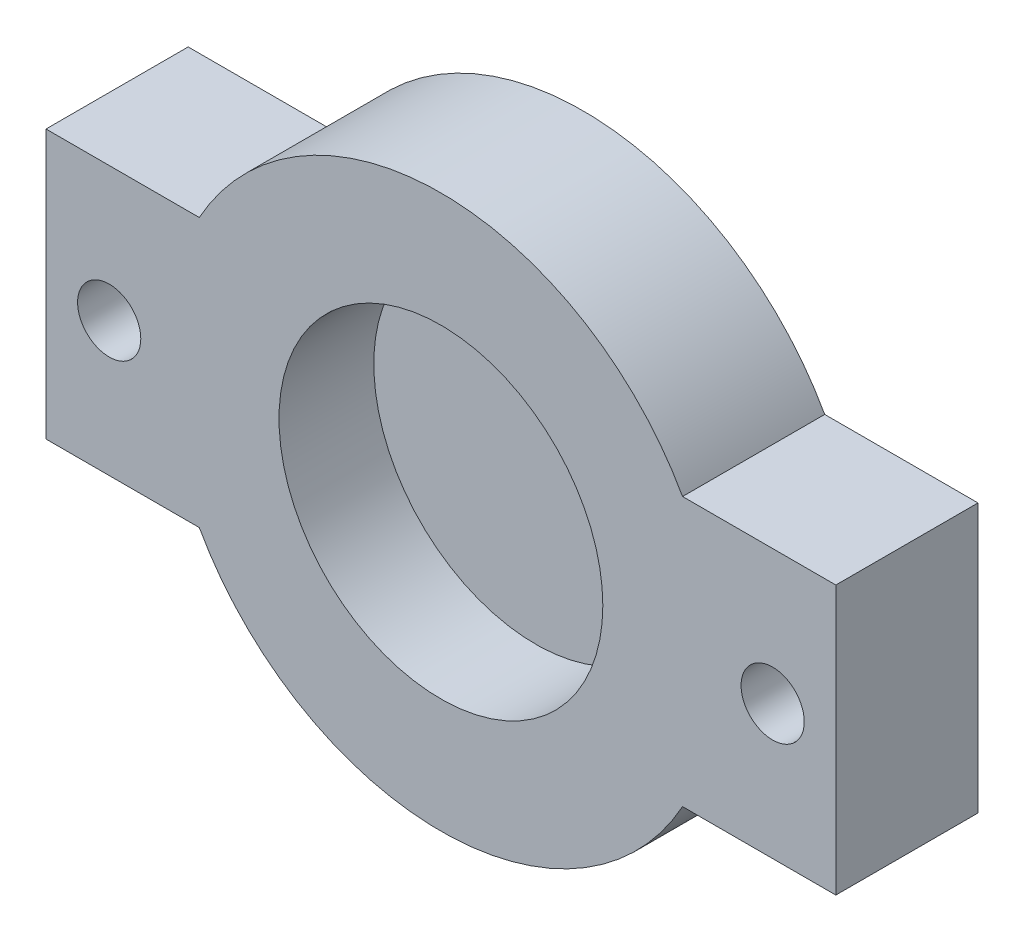
ISO-10303-21;
HEADER;
FILE_DESCRIPTION(('STEP AP214'),'2;1');
FILE_NAME('part.step','',(''),(''),'','','');
FILE_SCHEMA(('AUTOMOTIVE_DESIGN { 1 0 10303 214 1 1 1 1 }'));
ENDSEC;
DATA;
#1=APPLICATION_CONTEXT('core data for automotive mechanical design processes');
#2=APPLICATION_PROTOCOL_DEFINITION('international standard','automotive_design',2000,#1);
#3=PRODUCT_CONTEXT('',#1,'mechanical');
#4=PRODUCT('Part','Part','',(#3));
#5=PRODUCT_RELATED_PRODUCT_CATEGORY('part','',(#4));
#6=PRODUCT_DEFINITION_FORMATION('','',#4);
#7=PRODUCT_DEFINITION_CONTEXT('part definition',#1,'design');
#8=PRODUCT_DEFINITION('design','',#6,#7);
#9=PRODUCT_DEFINITION_SHAPE('','',#8);
#10=(LENGTH_UNIT() NAMED_UNIT(*) SI_UNIT(.MILLI.,.METRE.));
#11=(NAMED_UNIT(*) PLANE_ANGLE_UNIT() SI_UNIT($,.RADIAN.));
#12=(NAMED_UNIT(*) SI_UNIT($,.STERADIAN.) SOLID_ANGLE_UNIT());
#13=UNCERTAINTY_MEASURE_WITH_UNIT(LENGTH_MEASURE(1.E-05),#10,'distance_accuracy_value','');
#14=(GEOMETRIC_REPRESENTATION_CONTEXT(3) GLOBAL_UNCERTAINTY_ASSIGNED_CONTEXT((#13)) GLOBAL_UNIT_ASSIGNED_CONTEXT((#10,
#11,#12)) REPRESENTATION_CONTEXT('',''));
#15=CARTESIAN_POINT('',(0.,0.,0.));
#16=DIRECTION('',(0.,0.,1.));
#17=DIRECTION('',(1.,0.,0.));
#18=AXIS2_PLACEMENT_3D('',#15,#16,#17);
#19=CARTESIAN_POINT('',(0.,-8.5,9.));
#20=DIRECTION('',(0.,1.,0.));
#21=DIRECTION('',(0.,0.,1.));
#22=AXIS2_PLACEMENT_3D('',#19,#20,#21);
#23=PLANE('',#22);
#24=DIRECTION('',(1.,0.,0.));
#25=VECTOR('',#24,1.);
#26=CARTESIAN_POINT('',(0.,-8.5,0.));
#27=LINE('',#26,#25);
#28=CARTESIAN_POINT('',(-25.,-8.5,0.));
#29=VERTEX_POINT('',#28);
#30=CARTESIAN_POINT('',(-15.2970585407784,-8.5,0.));
#31=VERTEX_POINT('',#30);
#32=EDGE_CURVE('E151',#29,#31,#27,.T.);
#33=ORIENTED_EDGE('',*,*,#32,.T.);
#34=DIRECTION('',(0.,0.,-1.));
#35=VECTOR('',#34,1.);
#36=CARTESIAN_POINT('',(-15.2970585407784,-8.5,9.));
#37=LINE('',#36,#35);
#38=CARTESIAN_POINT('',(-15.2970585407784,-8.5,9.));
#39=VERTEX_POINT('',#38);
#40=EDGE_CURVE('E11',#39,#31,#37,.T.);
#41=ORIENTED_EDGE('',*,*,#40,.F.);
#42=DIRECTION('',(1.,0.,0.));
#43=VECTOR('',#42,1.);
#44=CARTESIAN_POINT('',(0.,-8.5,9.));
#45=LINE('',#44,#43);
#46=CARTESIAN_POINT('',(-25.,-8.5,9.));
#47=VERTEX_POINT('',#46);
#48=EDGE_CURVE('E186',#47,#39,#45,.T.);
#49=ORIENTED_EDGE('',*,*,#48,.F.);
#50=DIRECTION('',(0.,0.,-1.));
#51=VECTOR('',#50,1.);
#52=CARTESIAN_POINT('',(-25.,-8.5,9.));
#53=LINE('',#52,#51);
#54=EDGE_CURVE('E58',#47,#29,#53,.T.);
#55=ORIENTED_EDGE('',*,*,#54,.T.);
#56=EDGE_LOOP('',(#33,#41,#49,#55));
#57=FACE_BOUND('',#56,.T.);
#58=ADVANCED_FACE('F41',(#57),#23,.F.);
#59=CARTESIAN_POINT('',(0.,0.,9.));
#60=DIRECTION('',(0.,0.,-1.));
#61=DIRECTION('',(-1.,0.,0.));
#62=AXIS2_PLACEMENT_3D('',#59,#60,#61);
#63=CYLINDRICAL_SURFACE('',#62,17.5);
#64=CARTESIAN_POINT('',(0.,0.,0.));
#65=DIRECTION('',(0.,0.,1.));
#66=DIRECTION('',(1.,0.,0.));
#67=AXIS2_PLACEMENT_3D('',#64,#65,#66);
#68=CIRCLE('',#67,17.5);
#69=CARTESIAN_POINT('',(15.2970585407784,-8.5,0.));
#70=VERTEX_POINT('',#69);
#71=EDGE_CURVE('E154',#31,#70,#68,.T.);
#72=ORIENTED_EDGE('',*,*,#71,.T.);
#73=DIRECTION('',(0.,0.,-1.));
#74=VECTOR('',#73,1.);
#75=CARTESIAN_POINT('',(15.2970585407784,-8.5,9.));
#76=LINE('',#75,#74);
#77=CARTESIAN_POINT('',(15.2970585407784,-8.5,9.));
#78=VERTEX_POINT('',#77);
#79=EDGE_CURVE('E50',#78,#70,#76,.T.);
#80=ORIENTED_EDGE('',*,*,#79,.F.);
#81=CARTESIAN_POINT('',(0.,0.,9.));
#82=DIRECTION('',(0.,0.,1.));
#83=DIRECTION('',(1.,0.,0.));
#84=AXIS2_PLACEMENT_3D('',#81,#82,#83);
#85=CIRCLE('',#84,17.5);
#86=EDGE_CURVE('E96',#39,#78,#85,.T.);
#87=ORIENTED_EDGE('',*,*,#86,.F.);
#88=ORIENTED_EDGE('',*,*,#40,.T.);
#89=EDGE_LOOP('',(#72,#80,#87,#88));
#90=FACE_BOUND('',#89,.T.);
#91=ADVANCED_FACE('F255',(#90),#63,.T.);
#92=CARTESIAN_POINT('',(0.,-8.5,9.));
#93=DIRECTION('',(0.,1.,0.));
#94=DIRECTION('',(0.,0.,1.));
#95=AXIS2_PLACEMENT_3D('',#92,#93,#94);
#96=PLANE('',#95);
#97=DIRECTION('',(1.,0.,0.));
#98=VECTOR('',#97,1.);
#99=CARTESIAN_POINT('',(0.,-8.5,0.));
#100=LINE('',#99,#98);
#101=CARTESIAN_POINT('',(25.,-8.5,0.));
#102=VERTEX_POINT('',#101);
#103=EDGE_CURVE('E158',#70,#102,#100,.T.);
#104=ORIENTED_EDGE('',*,*,#103,.T.);
#105=DIRECTION('',(0.,0.,-1.));
#106=VECTOR('',#105,1.);
#107=CARTESIAN_POINT('',(25.,-8.5,9.));
#108=LINE('',#107,#106);
#109=CARTESIAN_POINT('',(25.,-8.5,9.));
#110=VERTEX_POINT('',#109);
#111=EDGE_CURVE('E196',#110,#102,#108,.T.);
#112=ORIENTED_EDGE('',*,*,#111,.F.);
#113=DIRECTION('',(1.,0.,0.));
#114=VECTOR('',#113,1.);
#115=CARTESIAN_POINT('',(0.,-8.5,9.));
#116=LINE('',#115,#114);
#117=EDGE_CURVE('E206',#78,#110,#116,.T.);
#118=ORIENTED_EDGE('',*,*,#117,.F.);
#119=ORIENTED_EDGE('',*,*,#79,.T.);
#120=EDGE_LOOP('',(#104,#112,#118,#119));
#121=FACE_BOUND('',#120,.T.);
#122=ADVANCED_FACE('F204',(#121),#96,.F.);
#123=CARTESIAN_POINT('',(25.,0.,9.));
#124=DIRECTION('',(-1.,0.,0.));
#125=DIRECTION('',(0.,0.,1.));
#126=AXIS2_PLACEMENT_3D('',#123,#124,#125);
#127=PLANE('',#126);
#128=DIRECTION('',(0.,1.,0.));
#129=VECTOR('',#128,1.);
#130=CARTESIAN_POINT('',(25.,0.,0.));
#131=LINE('',#130,#129);
#132=CARTESIAN_POINT('',(25.,8.5,0.));
#133=VERTEX_POINT('',#132);
#134=EDGE_CURVE('E161',#102,#133,#131,.T.);
#135=ORIENTED_EDGE('',*,*,#134,.T.);
#136=DIRECTION('',(0.,0.,-1.));
#137=VECTOR('',#136,1.);
#138=CARTESIAN_POINT('',(25.,8.5,9.));
#139=LINE('',#138,#137);
#140=CARTESIAN_POINT('',(25.,8.5,9.));
#141=VERTEX_POINT('',#140);
#142=EDGE_CURVE('E193',#141,#133,#139,.T.);
#143=ORIENTED_EDGE('',*,*,#142,.F.);
#144=DIRECTION('',(0.,1.,0.));
#145=VECTOR('',#144,1.);
#146=CARTESIAN_POINT('',(25.,0.,9.));
#147=LINE('',#146,#145);
#148=EDGE_CURVE('E216',#110,#141,#147,.T.);
#149=ORIENTED_EDGE('',*,*,#148,.F.);
#150=ORIENTED_EDGE('',*,*,#111,.T.);
#151=EDGE_LOOP('',(#135,#143,#149,#150));
#152=FACE_BOUND('',#151,.T.);
#153=ADVANCED_FACE('F214',(#152),#127,.F.);
#154=CARTESIAN_POINT('',(0.,8.5,9.));
#155=DIRECTION('',(0.,1.,0.));
#156=DIRECTION('',(0.,0.,1.));
#157=AXIS2_PLACEMENT_3D('',#154,#155,#156);
#158=PLANE('',#157);
#159=DIRECTION('',(1.,0.,0.));
#160=VECTOR('',#159,1.);
#161=CARTESIAN_POINT('',(0.,8.5,0.));
#162=LINE('',#161,#160);
#163=CARTESIAN_POINT('',(15.2970585407784,8.5,0.));
#164=VERTEX_POINT('',#163);
#165=EDGE_CURVE('E165',#164,#133,#162,.T.);
#166=ORIENTED_EDGE('',*,*,#165,.F.);
#167=DIRECTION('',(0.,0.,-1.));
#168=VECTOR('',#167,1.);
#169=CARTESIAN_POINT('',(15.2970585407784,8.5,9.));
#170=LINE('',#169,#168);
#171=CARTESIAN_POINT('',(15.2970585407784,8.5,9.));
#172=VERTEX_POINT('',#171);
#173=EDGE_CURVE('E133',#172,#164,#170,.T.);
#174=ORIENTED_EDGE('',*,*,#173,.F.);
#175=DIRECTION('',(1.,0.,0.));
#176=VECTOR('',#175,1.);
#177=CARTESIAN_POINT('',(0.,8.5,9.));
#178=LINE('',#177,#176);
#179=EDGE_CURVE('E121',#172,#141,#178,.T.);
#180=ORIENTED_EDGE('',*,*,#179,.T.);
#181=ORIENTED_EDGE('',*,*,#142,.T.);
#182=EDGE_LOOP('',(#166,#174,#180,#181));
#183=FACE_BOUND('',#182,.T.);
#184=ADVANCED_FACE('F273',(#183),#158,.T.);
#185=CARTESIAN_POINT('',(0.,0.,9.));
#186=DIRECTION('',(0.,0.,-1.));
#187=DIRECTION('',(-1.,0.,0.));
#188=AXIS2_PLACEMENT_3D('',#185,#186,#187);
#189=CYLINDRICAL_SURFACE('',#188,17.5);
#190=CARTESIAN_POINT('',(0.,0.,0.));
#191=DIRECTION('',(0.,0.,1.));
#192=DIRECTION('',(1.,0.,0.));
#193=AXIS2_PLACEMENT_3D('',#190,#191,#192);
#194=CIRCLE('',#193,17.5);
#195=CARTESIAN_POINT('',(-15.2970585407784,8.5,0.));
#196=VERTEX_POINT('',#195);
#197=EDGE_CURVE('E129',#164,#196,#194,.T.);
#198=ORIENTED_EDGE('',*,*,#197,.T.);
#199=DIRECTION('',(0.,0.,-1.));
#200=VECTOR('',#199,1.);
#201=CARTESIAN_POINT('',(-15.2970585407784,8.5,9.));
#202=LINE('',#201,#200);
#203=CARTESIAN_POINT('',(-15.2970585407784,8.5,9.));
#204=VERTEX_POINT('',#203);
#205=EDGE_CURVE('E126',#204,#196,#202,.T.);
#206=ORIENTED_EDGE('',*,*,#205,.F.);
#207=CARTESIAN_POINT('',(0.,0.,9.));
#208=DIRECTION('',(0.,0.,1.));
#209=DIRECTION('',(1.,0.,0.));
#210=AXIS2_PLACEMENT_3D('',#207,#208,#209);
#211=CIRCLE('',#210,17.5);
#212=EDGE_CURVE('E113',#172,#204,#211,.T.);
#213=ORIENTED_EDGE('',*,*,#212,.F.);
#214=ORIENTED_EDGE('',*,*,#173,.T.);
#215=EDGE_LOOP('',(#198,#206,#213,#214));
#216=FACE_BOUND('',#215,.T.);
#217=ADVANCED_FACE('F127',(#216),#189,.T.);
#218=CARTESIAN_POINT('',(0.,8.5,9.));
#219=DIRECTION('',(0.,1.,0.));
#220=DIRECTION('',(0.,0.,1.));
#221=AXIS2_PLACEMENT_3D('',#218,#219,#220);
#222=PLANE('',#221);
#223=DIRECTION('',(1.,0.,0.));
#224=VECTOR('',#223,1.);
#225=CARTESIAN_POINT('',(0.,8.5,0.));
#226=LINE('',#225,#224);
#227=CARTESIAN_POINT('',(-25.,8.5,0.));
#228=VERTEX_POINT('',#227);
#229=EDGE_CURVE('E171',#228,#196,#226,.T.);
#230=ORIENTED_EDGE('',*,*,#229,.F.);
#231=DIRECTION('',(0.,0.,-1.));
#232=VECTOR('',#231,1.);
#233=CARTESIAN_POINT('',(-25.,8.5,9.));
#234=LINE('',#233,#232);
#235=CARTESIAN_POINT('',(-25.,8.5,9.));
#236=VERTEX_POINT('',#235);
#237=EDGE_CURVE('E84',#236,#228,#234,.T.);
#238=ORIENTED_EDGE('',*,*,#237,.F.);
#239=DIRECTION('',(1.,0.,0.));
#240=VECTOR('',#239,1.);
#241=CARTESIAN_POINT('',(0.,8.5,9.));
#242=LINE('',#241,#240);
#243=EDGE_CURVE('E119',#236,#204,#242,.T.);
#244=ORIENTED_EDGE('',*,*,#243,.T.);
#245=ORIENTED_EDGE('',*,*,#205,.T.);
#246=EDGE_LOOP('',(#230,#238,#244,#245));
#247=FACE_BOUND('',#246,.T.);
#248=ADVANCED_FACE('F135',(#247),#222,.T.);
#249=CARTESIAN_POINT('',(-21.,0.,9.));
#250=DIRECTION('',(0.,0.,-1.));
#251=DIRECTION('',(-1.,0.,0.));
#252=AXIS2_PLACEMENT_3D('',#249,#250,#251);
#253=CYLINDRICAL_SURFACE('',#252,2.);
#254=CARTESIAN_POINT('',(-21.,0.,9.));
#255=DIRECTION('',(0.,0.,1.));
#256=DIRECTION('',(1.,0.,0.));
#257=AXIS2_PLACEMENT_3D('',#254,#255,#256);
#258=CIRCLE('',#257,2.);
#259=CARTESIAN_POINT('',(-19.,0.,9.));
#260=VERTEX_POINT('',#259);
#261=EDGE_CURVE('E140',#260,#260,#258,.F.);
#262=ORIENTED_EDGE('',*,*,#261,.F.);
#263=EDGE_LOOP('',(#262));
#264=FACE_BOUND('',#263,.T.);
#265=CARTESIAN_POINT('',(-21.,0.,0.));
#266=DIRECTION('',(0.,0.,1.));
#267=DIRECTION('',(1.,0.,0.));
#268=AXIS2_PLACEMENT_3D('',#265,#266,#267);
#269=CIRCLE('',#268,2.);
#270=CARTESIAN_POINT('',(-19.,0.,0.));
#271=VERTEX_POINT('',#270);
#272=EDGE_CURVE('E178',#271,#271,#269,.F.);
#273=ORIENTED_EDGE('',*,*,#272,.T.);
#274=EDGE_LOOP('',(#273));
#275=FACE_BOUND('',#274,.T.);
#276=ADVANCED_FACE('F261',(#264,#275),#253,.F.);
#277=CARTESIAN_POINT('',(-25.,0.,9.));
#278=DIRECTION('',(-1.,0.,0.));
#279=DIRECTION('',(0.,0.,1.));
#280=AXIS2_PLACEMENT_3D('',#277,#278,#279);
#281=PLANE('',#280);
#282=DIRECTION('',(0.,1.,0.));
#283=VECTOR('',#282,1.);
#284=CARTESIAN_POINT('',(-25.,0.,0.));
#285=LINE('',#284,#283);
#286=EDGE_CURVE('E174',#29,#228,#285,.T.);
#287=ORIENTED_EDGE('',*,*,#286,.F.);
#288=ORIENTED_EDGE('',*,*,#54,.F.);
#289=DIRECTION('',(0.,1.,0.));
#290=VECTOR('',#289,1.);
#291=CARTESIAN_POINT('',(-25.,0.,9.));
#292=LINE('',#291,#290);
#293=EDGE_CURVE('E137',#47,#236,#292,.T.);
#294=ORIENTED_EDGE('',*,*,#293,.T.);
#295=ORIENTED_EDGE('',*,*,#237,.T.);
#296=EDGE_LOOP('',(#287,#288,#294,#295));
#297=FACE_BOUND('',#296,.T.);
#298=ADVANCED_FACE('F251',(#297),#281,.T.);
#299=CARTESIAN_POINT('',(21.,0.,9.));
#300=DIRECTION('',(0.,0.,-1.));
#301=DIRECTION('',(-1.,0.,0.));
#302=AXIS2_PLACEMENT_3D('',#299,#300,#301);
#303=CYLINDRICAL_SURFACE('',#302,2.);
#304=CARTESIAN_POINT('',(21.,0.,9.));
#305=DIRECTION('',(0.,0.,1.));
#306=DIRECTION('',(1.,0.,0.));
#307=AXIS2_PLACEMENT_3D('',#304,#305,#306);
#308=CIRCLE('',#307,2.);
#309=CARTESIAN_POINT('',(23.,0.,9.));
#310=VERTEX_POINT('',#309);
#311=EDGE_CURVE('E147',#310,#310,#308,.T.);
#312=ORIENTED_EDGE('',*,*,#311,.T.);
#313=EDGE_LOOP('',(#312));
#314=FACE_BOUND('',#313,.T.);
#315=CARTESIAN_POINT('',(21.,0.,0.));
#316=DIRECTION('',(0.,0.,1.));
#317=DIRECTION('',(1.,0.,0.));
#318=AXIS2_PLACEMENT_3D('',#315,#316,#317);
#319=CIRCLE('',#318,2.);
#320=CARTESIAN_POINT('',(23.,0.,0.));
#321=VERTEX_POINT('',#320);
#322=EDGE_CURVE('E182',#321,#321,#319,.T.);
#323=ORIENTED_EDGE('',*,*,#322,.F.);
#324=EDGE_LOOP('',(#323));
#325=FACE_BOUND('',#324,.T.);
#326=ADVANCED_FACE('F244',(#314,#325),#303,.F.);
#327=CARTESIAN_POINT('',(0.,0.,9.));
#328=DIRECTION('',(0.,0.,1.));
#329=DIRECTION('',(1.,0.,0.));
#330=AXIS2_PLACEMENT_3D('',#327,#328,#329);
#331=PLANE('',#330);
#332=CARTESIAN_POINT('',(0.,0.,9.));
#333=DIRECTION('',(0.,0.,1.));
#334=DIRECTION('',(1.,0.,0.));
#335=AXIS2_PLACEMENT_3D('',#332,#333,#334);
#336=CIRCLE('',#335,10.25);
#337=CARTESIAN_POINT('',(10.25,0.,9.));
#338=VERTEX_POINT('',#337);
#339=EDGE_CURVE('E227',#338,#338,#336,.T.);
#340=ORIENTED_EDGE('',*,*,#339,.F.);
#341=EDGE_LOOP('',(#340));
#342=FACE_BOUND('',#341,.T.);
#343=ORIENTED_EDGE('',*,*,#48,.T.);
#344=ORIENTED_EDGE('',*,*,#86,.T.);
#345=ORIENTED_EDGE('',*,*,#117,.T.);
#346=ORIENTED_EDGE('',*,*,#148,.T.);
#347=ORIENTED_EDGE('',*,*,#179,.F.);
#348=ORIENTED_EDGE('',*,*,#212,.T.);
#349=ORIENTED_EDGE('',*,*,#243,.F.);
#350=ORIENTED_EDGE('',*,*,#293,.F.);
#351=EDGE_LOOP('',(#343,#344,#345,#346,#347,#348,#349,#350));
#352=FACE_BOUND('',#351,.T.);
#353=ORIENTED_EDGE('',*,*,#261,.T.);
#354=EDGE_LOOP('',(#353));
#355=FACE_BOUND('',#354,.T.);
#356=ORIENTED_EDGE('',*,*,#311,.F.);
#357=EDGE_LOOP('',(#356));
#358=FACE_BOUND('',#357,.T.);
#359=ADVANCED_FACE('F115',(#342,#352,#355,#358),#331,.T.);
#360=CARTESIAN_POINT('',(0.,0.,0.));
#361=DIRECTION('',(0.,0.,1.));
#362=DIRECTION('',(1.,0.,0.));
#363=AXIS2_PLACEMENT_3D('',#360,#361,#362);
#364=PLANE('',#363);
#365=ORIENTED_EDGE('',*,*,#32,.F.);
#366=ORIENTED_EDGE('',*,*,#286,.T.);
#367=ORIENTED_EDGE('',*,*,#229,.T.);
#368=ORIENTED_EDGE('',*,*,#197,.F.);
#369=ORIENTED_EDGE('',*,*,#165,.T.);
#370=ORIENTED_EDGE('',*,*,#134,.F.);
#371=ORIENTED_EDGE('',*,*,#103,.F.);
#372=ORIENTED_EDGE('',*,*,#71,.F.);
#373=EDGE_LOOP('',(#365,#366,#367,#368,#369,#370,#371,#372));
#374=FACE_BOUND('',#373,.T.);
#375=ORIENTED_EDGE('',*,*,#272,.F.);
#376=EDGE_LOOP('',(#375));
#377=FACE_BOUND('',#376,.T.);
#378=ORIENTED_EDGE('',*,*,#322,.T.);
#379=EDGE_LOOP('',(#378));
#380=FACE_BOUND('',#379,.T.);
#381=ADVANCED_FACE('F209',(#374,#377,#380),#364,.F.);
#382=CARTESIAN_POINT('',(0.,0.,3.));
#383=DIRECTION('',(0.,0.,1.));
#384=DIRECTION('',(1.,0.,0.));
#385=AXIS2_PLACEMENT_3D('',#382,#383,#384);
#386=CYLINDRICAL_SURFACE('',#385,10.25);
#387=CARTESIAN_POINT('',(0.,0.,3.));
#388=DIRECTION('',(0.,0.,1.));
#389=DIRECTION('',(1.,0.,0.));
#390=AXIS2_PLACEMENT_3D('',#387,#388,#389);
#391=CIRCLE('',#390,10.25);
#392=CARTESIAN_POINT('',(10.25,0.,3.));
#393=VERTEX_POINT('',#392);
#394=EDGE_CURVE('E155',#393,#393,#391,.T.);
#395=ORIENTED_EDGE('',*,*,#394,.F.);
#396=EDGE_LOOP('',(#395));
#397=FACE_BOUND('',#396,.T.);
#398=ORIENTED_EDGE('',*,*,#339,.T.);
#399=EDGE_LOOP('',(#398));
#400=FACE_BOUND('',#399,.T.);
#401=ADVANCED_FACE('F237',(#397,#400),#386,.F.);
#402=CARTESIAN_POINT('',(0.,0.,3.));
#403=DIRECTION('',(0.,0.,1.));
#404=DIRECTION('',(1.,0.,0.));
#405=AXIS2_PLACEMENT_3D('',#402,#403,#404);
#406=PLANE('',#405);
#407=ORIENTED_EDGE('',*,*,#394,.T.);
#408=EDGE_LOOP('',(#407));
#409=FACE_BOUND('',#408,.T.);
#410=ADVANCED_FACE('F235',(#409),#406,.T.);
#411=CLOSED_SHELL('',(#58,#91,#122,#153,#184,#217,#248,#276,#298,#326,#359,#381,#401,#410));
#412=MANIFOLD_SOLID_BREP('B2',#411);
#413=ADVANCED_BREP_SHAPE_REPRESENTATION('',(#18,#412),#14);
#414=SHAPE_DEFINITION_REPRESENTATION(#9,#413);
ENDSEC;
END-ISO-10303-21;
